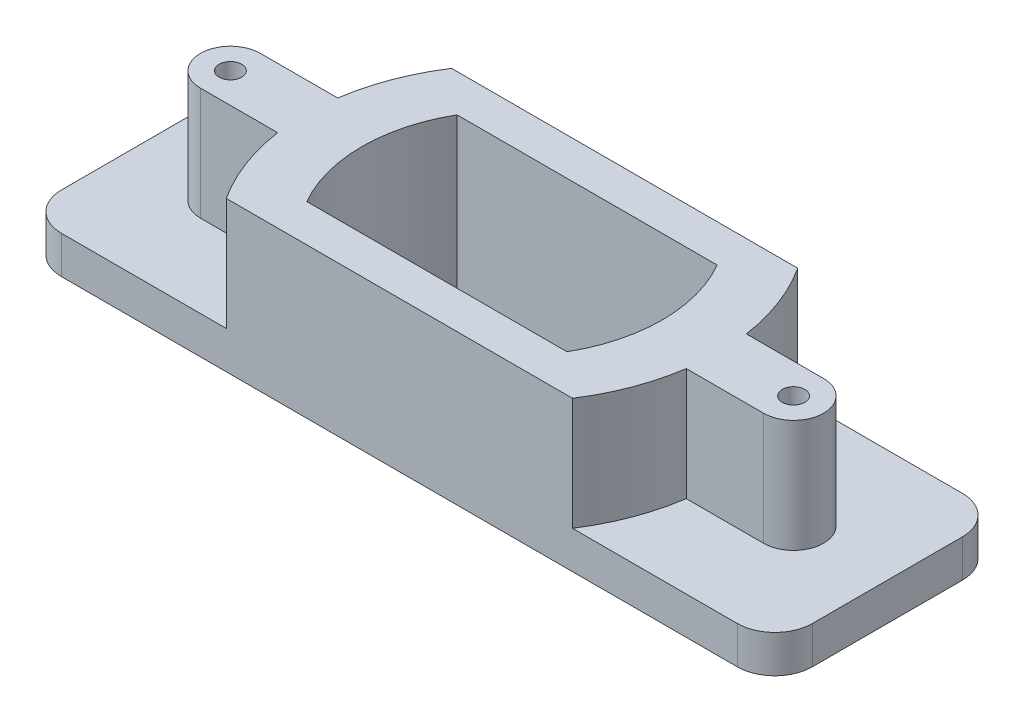
ISO-10303-21;
HEADER;
FILE_DESCRIPTION(('STEP AP214'),'2;1');
FILE_NAME('part.step','',(''),(''),'','','');
FILE_SCHEMA(('AUTOMOTIVE_DESIGN { 1 0 10303 214 1 1 1 1 }'));
ENDSEC;
DATA;
#1=APPLICATION_CONTEXT('core data for automotive mechanical design processes');
#2=APPLICATION_PROTOCOL_DEFINITION('international standard','automotive_design',2000,#1);
#3=PRODUCT_CONTEXT('',#1,'mechanical');
#4=PRODUCT('Part','Part','',(#3));
#5=PRODUCT_RELATED_PRODUCT_CATEGORY('part','',(#4));
#6=PRODUCT_DEFINITION_FORMATION('','',#4);
#7=PRODUCT_DEFINITION_CONTEXT('part definition',#1,'design');
#8=PRODUCT_DEFINITION('design','',#6,#7);
#9=PRODUCT_DEFINITION_SHAPE('','',#8);
#10=(LENGTH_UNIT() NAMED_UNIT(*) SI_UNIT(.MILLI.,.METRE.));
#11=(NAMED_UNIT(*) PLANE_ANGLE_UNIT() SI_UNIT($,.RADIAN.));
#12=(NAMED_UNIT(*) SI_UNIT($,.STERADIAN.) SOLID_ANGLE_UNIT());
#13=UNCERTAINTY_MEASURE_WITH_UNIT(LENGTH_MEASURE(1.E-05),#10,'distance_accuracy_value','');
#14=(GEOMETRIC_REPRESENTATION_CONTEXT(3) GLOBAL_UNCERTAINTY_ASSIGNED_CONTEXT((#13)) GLOBAL_UNIT_ASSIGNED_CONTEXT((#10,
#11,#12)) REPRESENTATION_CONTEXT('',''));
#15=CARTESIAN_POINT('',(0.,0.,0.));
#16=DIRECTION('',(0.,0.,1.));
#17=DIRECTION('',(1.,0.,0.));
#18=AXIS2_PLACEMENT_3D('',#15,#16,#17);
#19=CARTESIAN_POINT('',(-90.,10.,-20.));
#20=DIRECTION('',(0.,1.,0.));
#21=DIRECTION('',(0.,0.,1.));
#22=AXIS2_PLACEMENT_3D('',#19,#20,#21);
#23=PLANE('',#22);
#24=CARTESIAN_POINT('',(0.,10.,0.));
#25=DIRECTION('',(0.,1.,0.));
#26=DIRECTION('',(0.,0.,-1.));
#27=AXIS2_PLACEMENT_3D('',#24,#25,#26);
#28=CIRCLE('',#27,55.);
#29=CARTESIAN_POINT('',(54.4150714416512,10.,-7.99999999999999));
#30=VERTEX_POINT('',#29);
#31=CARTESIAN_POINT('',(46.0977222864645,10.,-30.));
#32=VERTEX_POINT('',#31);
#33=EDGE_CURVE('E241',#30,#32,#28,.T.);
#34=ORIENTED_EDGE('',*,*,#33,.F.);
#35=DIRECTION('',(-1.,0.,0.));
#36=VECTOR('',#35,1.);
#37=CARTESIAN_POINT('',(75.,10.,-7.99999999999999));
#38=LINE('',#37,#36);
#39=CARTESIAN_POINT('',(75.,10.,-7.99999999999999));
#40=VERTEX_POINT('',#39);
#41=EDGE_CURVE('E287',#40,#30,#38,.T.);
#42=ORIENTED_EDGE('',*,*,#41,.F.);
#43=CARTESIAN_POINT('',(75.,10.,0.));
#44=DIRECTION('',(0.,1.,0.));
#45=DIRECTION('',(0.,0.,1.));
#46=AXIS2_PLACEMENT_3D('',#43,#44,#45);
#47=CIRCLE('',#46,7.99999999999999);
#48=CARTESIAN_POINT('',(75.,10.,7.99999999999999));
#49=VERTEX_POINT('',#48);
#50=EDGE_CURVE('E284',#49,#40,#47,.T.);
#51=ORIENTED_EDGE('',*,*,#50,.F.);
#52=DIRECTION('',(1.,0.,0.));
#53=VECTOR('',#52,1.);
#54=CARTESIAN_POINT('',(75.,10.,7.99999999999999));
#55=LINE('',#54,#53);
#56=CARTESIAN_POINT('',(54.4150714416512,10.,7.99999999999999));
#57=VERTEX_POINT('',#56);
#58=EDGE_CURVE('E281',#57,#49,#55,.T.);
#59=ORIENTED_EDGE('',*,*,#58,.F.);
#60=CARTESIAN_POINT('',(0.,10.,0.));
#61=DIRECTION('',(0.,1.,0.));
#62=DIRECTION('',(0.,0.,1.));
#63=AXIS2_PLACEMENT_3D('',#60,#61,#62);
#64=CIRCLE('',#63,55.);
#65=CARTESIAN_POINT('',(46.0977222864644,10.,30.));
#66=VERTEX_POINT('',#65);
#67=EDGE_CURVE('E278',#66,#57,#64,.T.);
#68=ORIENTED_EDGE('',*,*,#67,.F.);
#69=DIRECTION('',(1.,0.,0.));
#70=VECTOR('',#69,1.);
#71=CARTESIAN_POINT('',(-90.,10.,30.));
#72=LINE('',#71,#70);
#73=CARTESIAN_POINT('',(90.,10.,30.));
#74=VERTEX_POINT('',#73);
#75=EDGE_CURVE('E337',#66,#74,#72,.T.);
#76=ORIENTED_EDGE('',*,*,#75,.T.);
#77=CARTESIAN_POINT('',(90.,10.,20.));
#78=DIRECTION('',(0.,1.,0.));
#79=DIRECTION('',(0.,0.,1.));
#80=AXIS2_PLACEMENT_3D('',#77,#78,#79);
#81=CIRCLE('',#80,9.99999999999998);
#82=CARTESIAN_POINT('',(100.,10.,20.));
#83=VERTEX_POINT('',#82);
#84=EDGE_CURVE('E340',#74,#83,#81,.T.);
#85=ORIENTED_EDGE('',*,*,#84,.T.);
#86=DIRECTION('',(0.,0.,-1.));
#87=VECTOR('',#86,1.);
#88=CARTESIAN_POINT('',(100.,10.,20.));
#89=LINE('',#88,#87);
#90=CARTESIAN_POINT('',(100.,10.,-20.));
#91=VERTEX_POINT('',#90);
#92=EDGE_CURVE('E342',#83,#91,#89,.T.);
#93=ORIENTED_EDGE('',*,*,#92,.T.);
#94=CARTESIAN_POINT('',(90.,10.,-20.));
#95=DIRECTION('',(0.,-1.,0.));
#96=DIRECTION('',(0.,0.,-1.));
#97=AXIS2_PLACEMENT_3D('',#94,#95,#96);
#98=CIRCLE('',#97,9.99999999999998);
#99=CARTESIAN_POINT('',(90.,10.,-30.));
#100=VERTEX_POINT('',#99);
#101=EDGE_CURVE('E344',#100,#91,#98,.T.);
#102=ORIENTED_EDGE('',*,*,#101,.F.);
#103=DIRECTION('',(1.,0.,0.));
#104=VECTOR('',#103,1.);
#105=CARTESIAN_POINT('',(-90.,10.,-30.));
#106=LINE('',#105,#104);
#107=EDGE_CURVE('E347',#32,#100,#106,.T.);
#108=ORIENTED_EDGE('',*,*,#107,.F.);
#109=EDGE_LOOP('',(#34,#42,#51,#59,#68,#76,#85,#93,#102,#108));
#110=FACE_BOUND('',#109,.T.);
#111=ADVANCED_FACE('F39',(#110),#23,.T.);
#112=CARTESIAN_POINT('',(-90.,10.,-20.));
#113=DIRECTION('',(0.,-1.,0.));
#114=DIRECTION('',(0.,0.,-1.));
#115=AXIS2_PLACEMENT_3D('',#112,#113,#114);
#116=CYLINDRICAL_SURFACE('',#115,9.99999999999998);
#117=CARTESIAN_POINT('',(-90.,0.,-20.));
#118=DIRECTION('',(0.,1.,0.));
#119=DIRECTION('',(0.,0.,1.));
#120=AXIS2_PLACEMENT_3D('',#117,#118,#119);
#121=CIRCLE('',#120,9.99999999999998);
#122=CARTESIAN_POINT('',(-90.,0.,-30.));
#123=VERTEX_POINT('',#122);
#124=CARTESIAN_POINT('',(-100.,0.,-20.));
#125=VERTEX_POINT('',#124);
#126=EDGE_CURVE('E327',#123,#125,#121,.T.);
#127=ORIENTED_EDGE('',*,*,#126,.T.);
#128=DIRECTION('',(0.,-1.,0.));
#129=VECTOR('',#128,1.);
#130=CARTESIAN_POINT('',(-100.,10.,-20.));
#131=LINE('',#130,#129);
#132=CARTESIAN_POINT('',(-100.,10.,-20.));
#133=VERTEX_POINT('',#132);
#134=EDGE_CURVE('E11',#133,#125,#131,.T.);
#135=ORIENTED_EDGE('',*,*,#134,.F.);
#136=CARTESIAN_POINT('',(-90.,10.,-20.));
#137=DIRECTION('',(0.,1.,0.));
#138=DIRECTION('',(0.,0.,1.));
#139=AXIS2_PLACEMENT_3D('',#136,#137,#138);
#140=CIRCLE('',#139,9.99999999999998);
#141=CARTESIAN_POINT('',(-90.,10.,-30.));
#142=VERTEX_POINT('',#141);
#143=EDGE_CURVE('E328',#142,#133,#140,.T.);
#144=ORIENTED_EDGE('',*,*,#143,.F.);
#145=DIRECTION('',(0.,-1.,0.));
#146=VECTOR('',#145,1.);
#147=CARTESIAN_POINT('',(-90.,10.,-30.));
#148=LINE('',#147,#146);
#149=EDGE_CURVE('E351',#142,#123,#148,.T.);
#150=ORIENTED_EDGE('',*,*,#149,.T.);
#151=EDGE_LOOP('',(#127,#135,#144,#150));
#152=FACE_BOUND('',#151,.T.);
#153=ADVANCED_FACE('F41',(#152),#116,.T.);
#154=CARTESIAN_POINT('',(-100.,10.,20.));
#155=DIRECTION('',(-1.,0.,0.));
#156=DIRECTION('',(0.,0.,1.));
#157=AXIS2_PLACEMENT_3D('',#154,#155,#156);
#158=PLANE('',#157);
#159=DIRECTION('',(0.,0.,-1.));
#160=VECTOR('',#159,1.);
#161=CARTESIAN_POINT('',(-100.,0.,20.));
#162=LINE('',#161,#160);
#163=CARTESIAN_POINT('',(-100.,0.,20.));
#164=VERTEX_POINT('',#163);
#165=EDGE_CURVE('E354',#164,#125,#162,.T.);
#166=ORIENTED_EDGE('',*,*,#165,.F.);
#167=DIRECTION('',(0.,-1.,0.));
#168=VECTOR('',#167,1.);
#169=CARTESIAN_POINT('',(-100.,10.,20.));
#170=LINE('',#169,#168);
#171=CARTESIAN_POINT('',(-100.,10.,20.));
#172=VERTEX_POINT('',#171);
#173=EDGE_CURVE('E47',#172,#164,#170,.T.);
#174=ORIENTED_EDGE('',*,*,#173,.F.);
#175=DIRECTION('',(0.,0.,-1.));
#176=VECTOR('',#175,1.);
#177=CARTESIAN_POINT('',(-100.,10.,20.));
#178=LINE('',#177,#176);
#179=EDGE_CURVE('E330',#172,#133,#178,.T.);
#180=ORIENTED_EDGE('',*,*,#179,.T.);
#181=ORIENTED_EDGE('',*,*,#134,.T.);
#182=EDGE_LOOP('',(#166,#174,#180,#181));
#183=FACE_BOUND('',#182,.T.);
#184=ADVANCED_FACE('F391',(#183),#158,.T.);
#185=CARTESIAN_POINT('',(-90.,10.,20.));
#186=DIRECTION('',(0.,-1.,0.));
#187=DIRECTION('',(0.,0.,-1.));
#188=AXIS2_PLACEMENT_3D('',#185,#186,#187);
#189=CYLINDRICAL_SURFACE('',#188,10.);
#190=CARTESIAN_POINT('',(-90.,0.,20.));
#191=DIRECTION('',(0.,-1.,0.));
#192=DIRECTION('',(0.,0.,-1.));
#193=AXIS2_PLACEMENT_3D('',#190,#191,#192);
#194=CIRCLE('',#193,10.);
#195=CARTESIAN_POINT('',(-90.,0.,30.));
#196=VERTEX_POINT('',#195);
#197=EDGE_CURVE('E357',#196,#164,#194,.T.);
#198=ORIENTED_EDGE('',*,*,#197,.F.);
#199=DIRECTION('',(0.,-1.,0.));
#200=VECTOR('',#199,1.);
#201=CARTESIAN_POINT('',(-90.,10.,30.));
#202=LINE('',#201,#200);
#203=CARTESIAN_POINT('',(-90.,10.,30.));
#204=VERTEX_POINT('',#203);
#205=EDGE_CURVE('E383',#204,#196,#202,.T.);
#206=ORIENTED_EDGE('',*,*,#205,.F.);
#207=CARTESIAN_POINT('',(-90.,10.,20.));
#208=DIRECTION('',(0.,-1.,0.));
#209=DIRECTION('',(0.,0.,-1.));
#210=AXIS2_PLACEMENT_3D('',#207,#208,#209);
#211=CIRCLE('',#210,10.);
#212=EDGE_CURVE('E334',#204,#172,#211,.T.);
#213=ORIENTED_EDGE('',*,*,#212,.T.);
#214=ORIENTED_EDGE('',*,*,#173,.T.);
#215=EDGE_LOOP('',(#198,#206,#213,#214));
#216=FACE_BOUND('',#215,.T.);
#217=ADVANCED_FACE('F387',(#216),#189,.T.);
#218=CARTESIAN_POINT('',(-90.,10.,30.));
#219=DIRECTION('',(0.,0.,-1.));
#220=DIRECTION('',(-1.,0.,0.));
#221=AXIS2_PLACEMENT_3D('',#218,#219,#220);
#222=PLANE('',#221);
#223=DIRECTION('',(1.,0.,0.));
#224=VECTOR('',#223,1.);
#225=CARTESIAN_POINT('',(-90.,0.,30.));
#226=LINE('',#225,#224);
#227=CARTESIAN_POINT('',(90.,0.,30.));
#228=VERTEX_POINT('',#227);
#229=EDGE_CURVE('E360',#196,#228,#226,.T.);
#230=ORIENTED_EDGE('',*,*,#229,.T.);
#231=DIRECTION('',(0.,-1.,0.));
#232=VECTOR('',#231,1.);
#233=CARTESIAN_POINT('',(90.,10.,30.));
#234=LINE('',#233,#232);
#235=EDGE_CURVE('E380',#74,#228,#234,.T.);
#236=ORIENTED_EDGE('',*,*,#235,.F.);
#237=ORIENTED_EDGE('',*,*,#75,.F.);
#238=DIRECTION('',(0.,-1.,0.));
#239=VECTOR('',#238,1.);
#240=CARTESIAN_POINT('',(46.0977222864644,40.,30.));
#241=LINE('',#240,#239);
#242=CARTESIAN_POINT('',(46.0977222864644,40.,30.));
#243=VERTEX_POINT('',#242);
#244=EDGE_CURVE('E309',#243,#66,#241,.T.);
#245=ORIENTED_EDGE('',*,*,#244,.F.);
#246=DIRECTION('',(1.,0.,0.));
#247=VECTOR('',#246,1.);
#248=CARTESIAN_POINT('',(-46.0977222864644,40.,30.));
#249=LINE('',#248,#247);
#250=CARTESIAN_POINT('',(-46.0977222864644,40.,30.));
#251=VERTEX_POINT('',#250);
#252=EDGE_CURVE('E249',#251,#243,#249,.T.);
#253=ORIENTED_EDGE('',*,*,#252,.F.);
#254=DIRECTION('',(0.,-1.,0.));
#255=VECTOR('',#254,1.);
#256=CARTESIAN_POINT('',(-46.0977222864644,40.,30.));
#257=LINE('',#256,#255);
#258=CARTESIAN_POINT('',(-46.0977222864644,10.,30.));
#259=VERTEX_POINT('',#258);
#260=EDGE_CURVE('E312',#251,#259,#257,.T.);
#261=ORIENTED_EDGE('',*,*,#260,.T.);
#262=EDGE_CURVE('E338',#204,#259,#72,.T.);
#263=ORIENTED_EDGE('',*,*,#262,.F.);
#264=ORIENTED_EDGE('',*,*,#205,.T.);
#265=EDGE_LOOP('',(#230,#236,#237,#245,#253,#261,#263,#264));
#266=FACE_BOUND('',#265,.T.);
#267=ADVANCED_FACE('F401',(#266),#222,.F.);
#268=CARTESIAN_POINT('',(90.,10.,20.));
#269=DIRECTION('',(0.,-1.,0.));
#270=DIRECTION('',(0.,0.,-1.));
#271=AXIS2_PLACEMENT_3D('',#268,#269,#270);
#272=CYLINDRICAL_SURFACE('',#271,9.99999999999998);
#273=CARTESIAN_POINT('',(90.,0.,20.));
#274=DIRECTION('',(0.,1.,0.));
#275=DIRECTION('',(0.,0.,1.));
#276=AXIS2_PLACEMENT_3D('',#273,#274,#275);
#277=CIRCLE('',#276,9.99999999999998);
#278=CARTESIAN_POINT('',(100.,0.,20.));
#279=VERTEX_POINT('',#278);
#280=EDGE_CURVE('E362',#228,#279,#277,.T.);
#281=ORIENTED_EDGE('',*,*,#280,.T.);
#282=DIRECTION('',(0.,-1.,0.));
#283=VECTOR('',#282,1.);
#284=CARTESIAN_POINT('',(100.,10.,20.));
#285=LINE('',#284,#283);
#286=EDGE_CURVE('E377',#83,#279,#285,.T.);
#287=ORIENTED_EDGE('',*,*,#286,.F.);
#288=ORIENTED_EDGE('',*,*,#84,.F.);
#289=ORIENTED_EDGE('',*,*,#235,.T.);
#290=EDGE_LOOP('',(#281,#287,#288,#289));
#291=FACE_BOUND('',#290,.T.);
#292=ADVANCED_FACE('F406',(#291),#272,.T.);
#293=CARTESIAN_POINT('',(100.,10.,20.));
#294=DIRECTION('',(-1.,0.,0.));
#295=DIRECTION('',(0.,0.,1.));
#296=AXIS2_PLACEMENT_3D('',#293,#294,#295);
#297=PLANE('',#296);
#298=DIRECTION('',(0.,0.,-1.));
#299=VECTOR('',#298,1.);
#300=CARTESIAN_POINT('',(100.,0.,20.));
#301=LINE('',#300,#299);
#302=CARTESIAN_POINT('',(100.,0.,-20.));
#303=VERTEX_POINT('',#302);
#304=EDGE_CURVE('E364',#279,#303,#301,.T.);
#305=ORIENTED_EDGE('',*,*,#304,.T.);
#306=DIRECTION('',(0.,-1.,0.));
#307=VECTOR('',#306,1.);
#308=CARTESIAN_POINT('',(100.,10.,-20.));
#309=LINE('',#308,#307);
#310=EDGE_CURVE('E375',#91,#303,#309,.T.);
#311=ORIENTED_EDGE('',*,*,#310,.F.);
#312=ORIENTED_EDGE('',*,*,#92,.F.);
#313=ORIENTED_EDGE('',*,*,#286,.T.);
#314=EDGE_LOOP('',(#305,#311,#312,#313));
#315=FACE_BOUND('',#314,.T.);
#316=ADVANCED_FACE('F454',(#315),#297,.F.);
#317=CARTESIAN_POINT('',(90.,10.,-20.));
#318=DIRECTION('',(0.,-1.,0.));
#319=DIRECTION('',(0.,0.,-1.));
#320=AXIS2_PLACEMENT_3D('',#317,#318,#319);
#321=CYLINDRICAL_SURFACE('',#320,9.99999999999998);
#322=CARTESIAN_POINT('',(90.,0.,-20.));
#323=DIRECTION('',(0.,-1.,0.));
#324=DIRECTION('',(0.,0.,-1.));
#325=AXIS2_PLACEMENT_3D('',#322,#323,#324);
#326=CIRCLE('',#325,9.99999999999998);
#327=CARTESIAN_POINT('',(90.,0.,-30.));
#328=VERTEX_POINT('',#327);
#329=EDGE_CURVE('E367',#328,#303,#326,.T.);
#330=ORIENTED_EDGE('',*,*,#329,.F.);
#331=DIRECTION('',(0.,-1.,0.));
#332=VECTOR('',#331,1.);
#333=CARTESIAN_POINT('',(90.,10.,-30.));
#334=LINE('',#333,#332);
#335=EDGE_CURVE('E373',#100,#328,#334,.T.);
#336=ORIENTED_EDGE('',*,*,#335,.F.);
#337=ORIENTED_EDGE('',*,*,#101,.T.);
#338=ORIENTED_EDGE('',*,*,#310,.T.);
#339=EDGE_LOOP('',(#330,#336,#337,#338));
#340=FACE_BOUND('',#339,.T.);
#341=ADVANCED_FACE('F452',(#340),#321,.T.);
#342=CARTESIAN_POINT('',(-90.,10.,-30.));
#343=DIRECTION('',(0.,0.,-1.));
#344=DIRECTION('',(-1.,0.,0.));
#345=AXIS2_PLACEMENT_3D('',#342,#343,#344);
#346=PLANE('',#345);
#347=DIRECTION('',(1.,0.,0.));
#348=VECTOR('',#347,1.);
#349=CARTESIAN_POINT('',(-90.,0.,-30.));
#350=LINE('',#349,#348);
#351=EDGE_CURVE('E331',#123,#328,#350,.T.);
#352=ORIENTED_EDGE('',*,*,#351,.F.);
#353=ORIENTED_EDGE('',*,*,#149,.F.);
#354=CARTESIAN_POINT('',(-46.0977222864645,10.,-30.));
#355=VERTEX_POINT('',#354);
#356=EDGE_CURVE('E348',#142,#355,#106,.T.);
#357=ORIENTED_EDGE('',*,*,#356,.T.);
#358=DIRECTION('',(0.,-1.,0.));
#359=VECTOR('',#358,1.);
#360=CARTESIAN_POINT('',(-46.0977222864644,40.,-30.));
#361=LINE('',#360,#359);
#362=CARTESIAN_POINT('',(-46.0977222864644,40.,-30.));
#363=VERTEX_POINT('',#362);
#364=EDGE_CURVE('E263',#363,#355,#361,.T.);
#365=ORIENTED_EDGE('',*,*,#364,.F.);
#366=DIRECTION('',(-1.,0.,0.));
#367=VECTOR('',#366,1.);
#368=CARTESIAN_POINT('',(-46.0977222864644,40.,-30.));
#369=LINE('',#368,#367);
#370=CARTESIAN_POINT('',(46.0977222864644,40.,-30.));
#371=VERTEX_POINT('',#370);
#372=EDGE_CURVE('E261',#371,#363,#369,.T.);
#373=ORIENTED_EDGE('',*,*,#372,.F.);
#374=DIRECTION('',(0.,-1.,0.));
#375=VECTOR('',#374,1.);
#376=CARTESIAN_POINT('',(46.0977222864644,40.,-30.));
#377=LINE('',#376,#375);
#378=EDGE_CURVE('E294',#371,#32,#377,.T.);
#379=ORIENTED_EDGE('',*,*,#378,.T.);
#380=ORIENTED_EDGE('',*,*,#107,.T.);
#381=ORIENTED_EDGE('',*,*,#335,.T.);
#382=EDGE_LOOP('',(#352,#353,#357,#365,#373,#379,#380,#381));
#383=FACE_BOUND('',#382,.T.);
#384=ADVANCED_FACE('F445',(#383),#346,.T.);
#385=CARTESIAN_POINT('',(0.,10.,0.));
#386=DIRECTION('',(0.,1.,0.));
#387=DIRECTION('',(0.,0.,1.));
#388=AXIS2_PLACEMENT_3D('',#385,#386,#387);
#389=CIRCLE('',#388,55.);
#390=CARTESIAN_POINT('',(-54.4150714416512,10.,-7.99999999999999));
#391=VERTEX_POINT('',#390);
#392=EDGE_CURVE('E236',#355,#391,#389,.T.);
#393=ORIENTED_EDGE('',*,*,#392,.F.);
#394=ORIENTED_EDGE('',*,*,#356,.F.);
#395=ORIENTED_EDGE('',*,*,#143,.T.);
#396=ORIENTED_EDGE('',*,*,#179,.F.);
#397=ORIENTED_EDGE('',*,*,#212,.F.);
#398=ORIENTED_EDGE('',*,*,#262,.T.);
#399=CARTESIAN_POINT('',(0.,10.,0.));
#400=DIRECTION('',(0.,1.,0.));
#401=DIRECTION('',(0.,0.,-1.));
#402=AXIS2_PLACEMENT_3D('',#399,#400,#401);
#403=CIRCLE('',#402,55.);
#404=CARTESIAN_POINT('',(-54.4150714416512,10.,8.00000000000002));
#405=VERTEX_POINT('',#404);
#406=EDGE_CURVE('E275',#405,#259,#403,.T.);
#407=ORIENTED_EDGE('',*,*,#406,.F.);
#408=DIRECTION('',(1.,0.,0.));
#409=VECTOR('',#408,1.);
#410=CARTESIAN_POINT('',(-75.,10.,7.99999999999999));
#411=LINE('',#410,#409);
#412=CARTESIAN_POINT('',(-75.,10.,7.99999999999999));
#413=VERTEX_POINT('',#412);
#414=EDGE_CURVE('E272',#413,#405,#411,.T.);
#415=ORIENTED_EDGE('',*,*,#414,.F.);
#416=CARTESIAN_POINT('',(-75.,10.,0.));
#417=DIRECTION('',(0.,1.,0.));
#418=DIRECTION('',(0.,0.,-1.));
#419=AXIS2_PLACEMENT_3D('',#416,#417,#418);
#420=CIRCLE('',#419,7.99999999999999);
#421=CARTESIAN_POINT('',(-75.,10.,-7.99999999999999));
#422=VERTEX_POINT('',#421);
#423=EDGE_CURVE('E269',#422,#413,#420,.T.);
#424=ORIENTED_EDGE('',*,*,#423,.F.);
#425=DIRECTION('',(-1.,0.,0.));
#426=VECTOR('',#425,1.);
#427=CARTESIAN_POINT('',(-75.,10.,-7.99999999999999));
#428=LINE('',#427,#426);
#429=EDGE_CURVE('E266',#391,#422,#428,.T.);
#430=ORIENTED_EDGE('',*,*,#429,.F.);
#431=EDGE_LOOP('',(#393,#394,#395,#396,#397,#398,#407,#415,#424,#430));
#432=FACE_BOUND('',#431,.T.);
#433=ADVANCED_FACE('F426',(#432),#23,.T.);
#434=CARTESIAN_POINT('',(-90.,0.,-20.));
#435=DIRECTION('',(0.,1.,0.));
#436=DIRECTION('',(0.,0.,1.));
#437=AXIS2_PLACEMENT_3D('',#434,#435,#436);
#438=PLANE('',#437);
#439=CARTESIAN_POINT('',(75.,0.,0.));
#440=DIRECTION('',(0.,-1.,0.));
#441=DIRECTION('',(0.,0.,1.));
#442=AXIS2_PLACEMENT_3D('',#439,#440,#441);
#443=CIRCLE('',#442,3.00000000000001);
#444=CARTESIAN_POINT('',(75.,0.,3.));
#445=VERTEX_POINT('',#444);
#446=EDGE_CURVE('E763',#445,#445,#443,.T.);
#447=ORIENTED_EDGE('',*,*,#446,.F.);
#448=EDGE_LOOP('',(#447));
#449=FACE_BOUND('',#448,.T.);
#450=CARTESIAN_POINT('',(-75.,0.,0.));
#451=DIRECTION('',(0.,-1.,0.));
#452=DIRECTION('',(0.,0.,-1.));
#453=AXIS2_PLACEMENT_3D('',#450,#451,#452);
#454=CIRCLE('',#453,3.00000000000001);
#455=CARTESIAN_POINT('',(-75.,0.,-3.00000000000002));
#456=VERTEX_POINT('',#455);
#457=EDGE_CURVE('E771',#456,#456,#454,.T.);
#458=ORIENTED_EDGE('',*,*,#457,.F.);
#459=EDGE_LOOP('',(#458));
#460=FACE_BOUND('',#459,.T.);
#461=CARTESIAN_POINT('',(0.,0.,0.));
#462=DIRECTION('',(0.,-1.,0.));
#463=DIRECTION('',(0.,0.,-1.));
#464=AXIS2_PLACEMENT_3D('',#461,#462,#463);
#465=CIRCLE('',#464,40.);
#466=CARTESIAN_POINT('',(-34.6410161513775,0.,20.));
#467=VERTEX_POINT('',#466);
#468=CARTESIAN_POINT('',(-34.6410161513775,0.,-20.));
#469=VERTEX_POINT('',#468);
#470=EDGE_CURVE('E223',#467,#469,#465,.T.);
#471=ORIENTED_EDGE('',*,*,#470,.F.);
#472=DIRECTION('',(-1.,0.,0.));
#473=VECTOR('',#472,1.);
#474=CARTESIAN_POINT('',(34.6410161513775,0.,20.));
#475=LINE('',#474,#473);
#476=CARTESIAN_POINT('',(34.6410161513775,0.,20.));
#477=VERTEX_POINT('',#476);
#478=EDGE_CURVE('E216',#477,#467,#475,.T.);
#479=ORIENTED_EDGE('',*,*,#478,.F.);
#480=CARTESIAN_POINT('',(0.,0.,0.));
#481=DIRECTION('',(0.,-1.,0.));
#482=DIRECTION('',(0.,0.,1.));
#483=AXIS2_PLACEMENT_3D('',#480,#481,#482);
#484=CIRCLE('',#483,40.);
#485=CARTESIAN_POINT('',(34.6410161513775,0.,-20.));
#486=VERTEX_POINT('',#485);
#487=EDGE_CURVE('E227',#486,#477,#484,.T.);
#488=ORIENTED_EDGE('',*,*,#487,.F.);
#489=DIRECTION('',(1.,0.,0.));
#490=VECTOR('',#489,1.);
#491=CARTESIAN_POINT('',(34.6410161513775,0.,-20.));
#492=LINE('',#491,#490);
#493=EDGE_CURVE('E54',#469,#486,#492,.T.);
#494=ORIENTED_EDGE('',*,*,#493,.F.);
#495=EDGE_LOOP('',(#471,#479,#488,#494));
#496=FACE_BOUND('',#495,.T.);
#497=ORIENTED_EDGE('',*,*,#126,.F.);
#498=ORIENTED_EDGE('',*,*,#351,.T.);
#499=ORIENTED_EDGE('',*,*,#329,.T.);
#500=ORIENTED_EDGE('',*,*,#304,.F.);
#501=ORIENTED_EDGE('',*,*,#280,.F.);
#502=ORIENTED_EDGE('',*,*,#229,.F.);
#503=ORIENTED_EDGE('',*,*,#197,.T.);
#504=ORIENTED_EDGE('',*,*,#165,.T.);
#505=EDGE_LOOP('',(#497,#498,#499,#500,#501,#502,#503,#504));
#506=FACE_BOUND('',#505,.T.);
#507=ADVANCED_FACE('F396',(#449,#460,#496,#506),#438,.F.);
#508=CARTESIAN_POINT('',(0.,40.,0.));
#509=DIRECTION('',(0.,-1.,0.));
#510=DIRECTION('',(0.,0.,-1.));
#511=AXIS2_PLACEMENT_3D('',#508,#509,#510);
#512=CYLINDRICAL_SURFACE('',#511,55.);
#513=ORIENTED_EDGE('',*,*,#392,.T.);
#514=DIRECTION('',(0.,-1.,0.));
#515=VECTOR('',#514,1.);
#516=CARTESIAN_POINT('',(-54.4150714416512,40.,-7.99999999999999));
#517=LINE('',#516,#515);
#518=CARTESIAN_POINT('',(-54.4150714416512,40.,-7.99999999999999));
#519=VERTEX_POINT('',#518);
#520=EDGE_CURVE('E324',#519,#391,#517,.T.);
#521=ORIENTED_EDGE('',*,*,#520,.F.);
#522=CARTESIAN_POINT('',(0.,40.,0.));
#523=DIRECTION('',(0.,1.,0.));
#524=DIRECTION('',(0.,0.,1.));
#525=AXIS2_PLACEMENT_3D('',#522,#523,#524);
#526=CIRCLE('',#525,55.);
#527=EDGE_CURVE('E237',#363,#519,#526,.T.);
#528=ORIENTED_EDGE('',*,*,#527,.F.);
#529=ORIENTED_EDGE('',*,*,#364,.T.);
#530=EDGE_LOOP('',(#513,#521,#528,#529));
#531=FACE_BOUND('',#530,.T.);
#532=ADVANCED_FACE('F440',(#531),#512,.T.);
#533=CARTESIAN_POINT('',(-75.,40.,-7.99999999999999));
#534=DIRECTION('',(0.,0.,1.));
#535=DIRECTION('',(1.,0.,0.));
#536=AXIS2_PLACEMENT_3D('',#533,#534,#535);
#537=PLANE('',#536);
#538=ORIENTED_EDGE('',*,*,#429,.T.);
#539=DIRECTION('',(0.,-1.,0.));
#540=VECTOR('',#539,1.);
#541=CARTESIAN_POINT('',(-75.,40.,-7.99999999999999));
#542=LINE('',#541,#540);
#543=CARTESIAN_POINT('',(-75.,40.,-7.99999999999999));
#544=VERTEX_POINT('',#543);
#545=EDGE_CURVE('E321',#544,#422,#542,.T.);
#546=ORIENTED_EDGE('',*,*,#545,.F.);
#547=DIRECTION('',(-1.,0.,0.));
#548=VECTOR('',#547,1.);
#549=CARTESIAN_POINT('',(-75.,40.,-7.99999999999999));
#550=LINE('',#549,#548);
#551=EDGE_CURVE('E240',#519,#544,#550,.T.);
#552=ORIENTED_EDGE('',*,*,#551,.F.);
#553=ORIENTED_EDGE('',*,*,#520,.T.);
#554=EDGE_LOOP('',(#538,#546,#552,#553));
#555=FACE_BOUND('',#554,.T.);
#556=ADVANCED_FACE('F436',(#555),#537,.F.);
#557=CARTESIAN_POINT('',(-75.,40.,0.));
#558=DIRECTION('',(0.,-1.,0.));
#559=DIRECTION('',(0.,0.,-1.));
#560=AXIS2_PLACEMENT_3D('',#557,#558,#559);
#561=CYLINDRICAL_SURFACE('',#560,7.99999999999999);
#562=ORIENTED_EDGE('',*,*,#423,.T.);
#563=DIRECTION('',(0.,-1.,0.));
#564=VECTOR('',#563,1.);
#565=CARTESIAN_POINT('',(-75.,40.,7.99999999999999));
#566=LINE('',#565,#564);
#567=CARTESIAN_POINT('',(-75.,40.,7.99999999999999));
#568=VERTEX_POINT('',#567);
#569=EDGE_CURVE('E318',#568,#413,#566,.T.);
#570=ORIENTED_EDGE('',*,*,#569,.F.);
#571=CARTESIAN_POINT('',(-75.,40.,0.));
#572=DIRECTION('',(0.,1.,0.));
#573=DIRECTION('',(0.,0.,-1.));
#574=AXIS2_PLACEMENT_3D('',#571,#572,#573);
#575=CIRCLE('',#574,7.99999999999999);
#576=EDGE_CURVE('E243',#544,#568,#575,.T.);
#577=ORIENTED_EDGE('',*,*,#576,.F.);
#578=ORIENTED_EDGE('',*,*,#545,.T.);
#579=EDGE_LOOP('',(#562,#570,#577,#578));
#580=FACE_BOUND('',#579,.T.);
#581=ADVANCED_FACE('F433',(#580),#561,.T.);
#582=CARTESIAN_POINT('',(-75.,40.,7.99999999999999));
#583=DIRECTION('',(0.,0.,-1.));
#584=DIRECTION('',(-1.,0.,0.));
#585=AXIS2_PLACEMENT_3D('',#582,#583,#584);
#586=PLANE('',#585);
#587=ORIENTED_EDGE('',*,*,#414,.T.);
#588=DIRECTION('',(0.,-1.,0.));
#589=VECTOR('',#588,1.);
#590=CARTESIAN_POINT('',(-54.4150714416512,40.,8.00000000000002));
#591=LINE('',#590,#589);
#592=CARTESIAN_POINT('',(-54.4150714416512,40.,8.00000000000002));
#593=VERTEX_POINT('',#592);
#594=EDGE_CURVE('E315',#593,#405,#591,.T.);
#595=ORIENTED_EDGE('',*,*,#594,.F.);
#596=DIRECTION('',(1.,0.,0.));
#597=VECTOR('',#596,1.);
#598=CARTESIAN_POINT('',(-75.,40.,7.99999999999999));
#599=LINE('',#598,#597);
#600=EDGE_CURVE('E245',#568,#593,#599,.T.);
#601=ORIENTED_EDGE('',*,*,#600,.F.);
#602=ORIENTED_EDGE('',*,*,#569,.T.);
#603=EDGE_LOOP('',(#587,#595,#601,#602));
#604=FACE_BOUND('',#603,.T.);
#605=ADVANCED_FACE('F428',(#604),#586,.F.);
#606=CARTESIAN_POINT('',(0.,40.,0.));
#607=DIRECTION('',(0.,-1.,0.));
#608=DIRECTION('',(0.,0.,-1.));
#609=AXIS2_PLACEMENT_3D('',#606,#607,#608);
#610=CYLINDRICAL_SURFACE('',#609,55.);
#611=ORIENTED_EDGE('',*,*,#406,.T.);
#612=ORIENTED_EDGE('',*,*,#260,.F.);
#613=CARTESIAN_POINT('',(0.,40.,0.));
#614=DIRECTION('',(0.,1.,0.));
#615=DIRECTION('',(0.,0.,-1.));
#616=AXIS2_PLACEMENT_3D('',#613,#614,#615);
#617=CIRCLE('',#616,55.);
#618=EDGE_CURVE('E247',#593,#251,#617,.T.);
#619=ORIENTED_EDGE('',*,*,#618,.F.);
#620=ORIENTED_EDGE('',*,*,#594,.T.);
#621=EDGE_LOOP('',(#611,#612,#619,#620));
#622=FACE_BOUND('',#621,.T.);
#623=ADVANCED_FACE('F423',(#622),#610,.T.);
#624=CARTESIAN_POINT('',(0.,40.,0.));
#625=DIRECTION('',(0.,-1.,0.));
#626=DIRECTION('',(0.,0.,-1.));
#627=AXIS2_PLACEMENT_3D('',#624,#625,#626);
#628=CYLINDRICAL_SURFACE('',#627,55.);
#629=ORIENTED_EDGE('',*,*,#67,.T.);
#630=DIRECTION('',(0.,-1.,0.));
#631=VECTOR('',#630,1.);
#632=CARTESIAN_POINT('',(54.4150714416512,40.,7.99999999999999));
#633=LINE('',#632,#631);
#634=CARTESIAN_POINT('',(54.4150714416512,40.,7.99999999999999));
#635=VERTEX_POINT('',#634);
#636=EDGE_CURVE('E306',#635,#57,#633,.T.);
#637=ORIENTED_EDGE('',*,*,#636,.F.);
#638=CARTESIAN_POINT('',(0.,40.,0.));
#639=DIRECTION('',(0.,1.,0.));
#640=DIRECTION('',(0.,0.,1.));
#641=AXIS2_PLACEMENT_3D('',#638,#639,#640);
#642=CIRCLE('',#641,55.);
#643=EDGE_CURVE('E251',#243,#635,#642,.T.);
#644=ORIENTED_EDGE('',*,*,#643,.F.);
#645=ORIENTED_EDGE('',*,*,#244,.T.);
#646=EDGE_LOOP('',(#629,#637,#644,#645));
#647=FACE_BOUND('',#646,.T.);
#648=ADVANCED_FACE('F416',(#647),#628,.T.);
#649=CARTESIAN_POINT('',(75.,40.,7.99999999999999));
#650=DIRECTION('',(0.,0.,-1.));
#651=DIRECTION('',(-1.,0.,0.));
#652=AXIS2_PLACEMENT_3D('',#649,#650,#651);
#653=PLANE('',#652);
#654=ORIENTED_EDGE('',*,*,#58,.T.);
#655=DIRECTION('',(0.,-1.,0.));
#656=VECTOR('',#655,1.);
#657=CARTESIAN_POINT('',(75.,40.,7.99999999999999));
#658=LINE('',#657,#656);
#659=CARTESIAN_POINT('',(75.,40.,7.99999999999999));
#660=VERTEX_POINT('',#659);
#661=EDGE_CURVE('E303',#660,#49,#658,.T.);
#662=ORIENTED_EDGE('',*,*,#661,.F.);
#663=DIRECTION('',(1.,0.,0.));
#664=VECTOR('',#663,1.);
#665=CARTESIAN_POINT('',(75.,40.,7.99999999999999));
#666=LINE('',#665,#664);
#667=EDGE_CURVE('E253',#635,#660,#666,.T.);
#668=ORIENTED_EDGE('',*,*,#667,.F.);
#669=ORIENTED_EDGE('',*,*,#636,.T.);
#670=EDGE_LOOP('',(#654,#662,#668,#669));
#671=FACE_BOUND('',#670,.T.);
#672=ADVANCED_FACE('F673',(#671),#653,.F.);
#673=CARTESIAN_POINT('',(75.,40.,0.));
#674=DIRECTION('',(0.,-1.,0.));
#675=DIRECTION('',(0.,0.,-1.));
#676=AXIS2_PLACEMENT_3D('',#673,#674,#675);
#677=CYLINDRICAL_SURFACE('',#676,7.99999999999999);
#678=ORIENTED_EDGE('',*,*,#50,.T.);
#679=DIRECTION('',(0.,-1.,0.));
#680=VECTOR('',#679,1.);
#681=CARTESIAN_POINT('',(75.,40.,-7.99999999999999));
#682=LINE('',#681,#680);
#683=CARTESIAN_POINT('',(75.,40.,-7.99999999999999));
#684=VERTEX_POINT('',#683);
#685=EDGE_CURVE('E300',#684,#40,#682,.T.);
#686=ORIENTED_EDGE('',*,*,#685,.F.);
#687=CARTESIAN_POINT('',(75.,40.,0.));
#688=DIRECTION('',(0.,1.,0.));
#689=DIRECTION('',(0.,0.,1.));
#690=AXIS2_PLACEMENT_3D('',#687,#688,#689);
#691=CIRCLE('',#690,7.99999999999999);
#692=EDGE_CURVE('E255',#660,#684,#691,.T.);
#693=ORIENTED_EDGE('',*,*,#692,.F.);
#694=ORIENTED_EDGE('',*,*,#661,.T.);
#695=EDGE_LOOP('',(#678,#686,#693,#694));
#696=FACE_BOUND('',#695,.T.);
#697=ADVANCED_FACE('F664',(#696),#677,.T.);
#698=CARTESIAN_POINT('',(75.,40.,-7.99999999999999));
#699=DIRECTION('',(0.,0.,1.));
#700=DIRECTION('',(1.,0.,0.));
#701=AXIS2_PLACEMENT_3D('',#698,#699,#700);
#702=PLANE('',#701);
#703=ORIENTED_EDGE('',*,*,#41,.T.);
#704=DIRECTION('',(0.,-1.,0.));
#705=VECTOR('',#704,1.);
#706=CARTESIAN_POINT('',(54.4150714416512,40.,-7.99999999999999));
#707=LINE('',#706,#705);
#708=CARTESIAN_POINT('',(54.4150714416512,40.,-7.99999999999999));
#709=VERTEX_POINT('',#708);
#710=EDGE_CURVE('E297',#709,#30,#707,.T.);
#711=ORIENTED_EDGE('',*,*,#710,.F.);
#712=DIRECTION('',(-1.,0.,0.));
#713=VECTOR('',#712,1.);
#714=CARTESIAN_POINT('',(75.,40.,-7.99999999999999));
#715=LINE('',#714,#713);
#716=EDGE_CURVE('E257',#684,#709,#715,.T.);
#717=ORIENTED_EDGE('',*,*,#716,.F.);
#718=ORIENTED_EDGE('',*,*,#685,.T.);
#719=EDGE_LOOP('',(#703,#711,#717,#718));
#720=FACE_BOUND('',#719,.T.);
#721=ADVANCED_FACE('F655',(#720),#702,.F.);
#722=CARTESIAN_POINT('',(0.,40.,0.));
#723=DIRECTION('',(0.,-1.,0.));
#724=DIRECTION('',(0.,0.,-1.));
#725=AXIS2_PLACEMENT_3D('',#722,#723,#724);
#726=CYLINDRICAL_SURFACE('',#725,55.);
#727=ORIENTED_EDGE('',*,*,#33,.T.);
#728=ORIENTED_EDGE('',*,*,#378,.F.);
#729=CARTESIAN_POINT('',(0.,40.,0.));
#730=DIRECTION('',(0.,1.,0.));
#731=DIRECTION('',(0.,0.,-1.));
#732=AXIS2_PLACEMENT_3D('',#729,#730,#731);
#733=CIRCLE('',#732,55.);
#734=EDGE_CURVE('E259',#709,#371,#733,.T.);
#735=ORIENTED_EDGE('',*,*,#734,.F.);
#736=ORIENTED_EDGE('',*,*,#710,.T.);
#737=EDGE_LOOP('',(#727,#728,#735,#736));
#738=FACE_BOUND('',#737,.T.);
#739=ADVANCED_FACE('F571',(#738),#726,.T.);
#740=CARTESIAN_POINT('',(0.,40.,0.));
#741=DIRECTION('',(0.,1.,0.));
#742=DIRECTION('',(0.,0.,1.));
#743=AXIS2_PLACEMENT_3D('',#740,#741,#742);
#744=PLANE('',#743);
#745=CARTESIAN_POINT('',(75.,40.,0.));
#746=DIRECTION('',(0.,1.,0.));
#747=DIRECTION('',(0.,0.,1.));
#748=AXIS2_PLACEMENT_3D('',#745,#746,#747);
#749=CIRCLE('',#748,3.00000000000001);
#750=CARTESIAN_POINT('',(75.,40.,3.));
#751=VERTEX_POINT('',#750);
#752=EDGE_CURVE('E766',#751,#751,#749,.F.);
#753=ORIENTED_EDGE('',*,*,#752,.T.);
#754=EDGE_LOOP('',(#753));
#755=FACE_BOUND('',#754,.T.);
#756=CARTESIAN_POINT('',(-75.,40.,0.));
#757=DIRECTION('',(0.,1.,0.));
#758=DIRECTION('',(0.,0.,1.));
#759=AXIS2_PLACEMENT_3D('',#756,#757,#758);
#760=CIRCLE('',#759,3.00000000000001);
#761=CARTESIAN_POINT('',(-75.,40.,3.));
#762=VERTEX_POINT('',#761);
#763=EDGE_CURVE('E768',#762,#762,#760,.F.);
#764=ORIENTED_EDGE('',*,*,#763,.T.);
#765=EDGE_LOOP('',(#764));
#766=FACE_BOUND('',#765,.T.);
#767=DIRECTION('',(-1.,0.,0.));
#768=VECTOR('',#767,1.);
#769=CARTESIAN_POINT('',(34.6410161513775,40.,20.));
#770=LINE('',#769,#768);
#771=CARTESIAN_POINT('',(34.6410161513775,40.,20.));
#772=VERTEX_POINT('',#771);
#773=CARTESIAN_POINT('',(-34.6410161513775,40.,20.));
#774=VERTEX_POINT('',#773);
#775=EDGE_CURVE('E213',#772,#774,#770,.T.);
#776=ORIENTED_EDGE('',*,*,#775,.T.);
#777=CARTESIAN_POINT('',(0.,40.,0.));
#778=DIRECTION('',(0.,1.,0.));
#779=DIRECTION('',(0.,0.,1.));
#780=AXIS2_PLACEMENT_3D('',#777,#778,#779);
#781=CIRCLE('',#780,40.);
#782=CARTESIAN_POINT('',(-34.6410161513775,40.,-20.));
#783=VERTEX_POINT('',#782);
#784=EDGE_CURVE('E200',#774,#783,#781,.F.);
#785=ORIENTED_EDGE('',*,*,#784,.T.);
#786=DIRECTION('',(1.,0.,0.));
#787=VECTOR('',#786,1.);
#788=CARTESIAN_POINT('',(34.6410161513775,40.,-20.));
#789=LINE('',#788,#787);
#790=CARTESIAN_POINT('',(34.6410161513775,40.,-20.));
#791=VERTEX_POINT('',#790);
#792=EDGE_CURVE('E231',#783,#791,#789,.T.);
#793=ORIENTED_EDGE('',*,*,#792,.T.);
#794=CARTESIAN_POINT('',(0.,40.,0.));
#795=DIRECTION('',(0.,1.,0.));
#796=DIRECTION('',(0.,0.,1.));
#797=AXIS2_PLACEMENT_3D('',#794,#795,#796);
#798=CIRCLE('',#797,40.);
#799=EDGE_CURVE('E221',#791,#772,#798,.F.);
#800=ORIENTED_EDGE('',*,*,#799,.T.);
#801=EDGE_LOOP('',(#776,#785,#793,#800));
#802=FACE_BOUND('',#801,.T.);
#803=ORIENTED_EDGE('',*,*,#527,.T.);
#804=ORIENTED_EDGE('',*,*,#551,.T.);
#805=ORIENTED_EDGE('',*,*,#576,.T.);
#806=ORIENTED_EDGE('',*,*,#600,.T.);
#807=ORIENTED_EDGE('',*,*,#618,.T.);
#808=ORIENTED_EDGE('',*,*,#252,.T.);
#809=ORIENTED_EDGE('',*,*,#643,.T.);
#810=ORIENTED_EDGE('',*,*,#667,.T.);
#811=ORIENTED_EDGE('',*,*,#692,.T.);
#812=ORIENTED_EDGE('',*,*,#716,.T.);
#813=ORIENTED_EDGE('',*,*,#734,.T.);
#814=ORIENTED_EDGE('',*,*,#372,.T.);
#815=EDGE_LOOP('',(#803,#804,#805,#806,#807,#808,#809,#810,#811,#812,#813,#814));
#816=FACE_BOUND('',#815,.T.);
#817=ADVANCED_FACE('F219',(#755,#766,#802,#816),#744,.T.);
#818=CARTESIAN_POINT('',(34.6410161513775,129.442719099992,20.));
#819=DIRECTION('',(0.,0.,1.));
#820=DIRECTION('',(1.,0.,0.));
#821=AXIS2_PLACEMENT_3D('',#818,#819,#820);
#822=PLANE('',#821);
#823=DIRECTION('',(0.,-1.,0.));
#824=VECTOR('',#823,1.);
#825=CARTESIAN_POINT('',(34.6410161513775,129.442719099992,20.));
#826=LINE('',#825,#824);
#827=EDGE_CURVE('E62',#772,#477,#826,.T.);
#828=ORIENTED_EDGE('',*,*,#827,.T.);
#829=ORIENTED_EDGE('',*,*,#478,.T.);
#830=DIRECTION('',(0.,-1.,0.));
#831=VECTOR('',#830,1.);
#832=CARTESIAN_POINT('',(-34.6410161513775,129.442719099992,20.));
#833=LINE('',#832,#831);
#834=EDGE_CURVE('E204',#774,#467,#833,.T.);
#835=ORIENTED_EDGE('',*,*,#834,.F.);
#836=ORIENTED_EDGE('',*,*,#775,.F.);
#837=EDGE_LOOP('',(#828,#829,#835,#836));
#838=FACE_BOUND('',#837,.T.);
#839=ADVANCED_FACE('F212',(#838),#822,.F.);
#840=CARTESIAN_POINT('',(0.,129.442719099992,0.));
#841=DIRECTION('',(0.,-1.,0.));
#842=DIRECTION('',(0.,0.,-1.));
#843=AXIS2_PLACEMENT_3D('',#840,#841,#842);
#844=CYLINDRICAL_SURFACE('',#843,40.);
#845=ORIENTED_EDGE('',*,*,#834,.T.);
#846=ORIENTED_EDGE('',*,*,#470,.T.);
#847=DIRECTION('',(0.,-1.,0.));
#848=VECTOR('',#847,1.);
#849=CARTESIAN_POINT('',(-34.6410161513775,129.442719099992,-20.));
#850=LINE('',#849,#848);
#851=EDGE_CURVE('E206',#783,#469,#850,.T.);
#852=ORIENTED_EDGE('',*,*,#851,.F.);
#853=ORIENTED_EDGE('',*,*,#784,.F.);
#854=EDGE_LOOP('',(#845,#846,#852,#853));
#855=FACE_BOUND('',#854,.T.);
#856=ADVANCED_FACE('F202',(#855),#844,.F.);
#857=CARTESIAN_POINT('',(34.6410161513775,129.442719099992,-20.));
#858=DIRECTION('',(0.,0.,-1.));
#859=DIRECTION('',(-1.,0.,0.));
#860=AXIS2_PLACEMENT_3D('',#857,#858,#859);
#861=PLANE('',#860);
#862=ORIENTED_EDGE('',*,*,#851,.T.);
#863=ORIENTED_EDGE('',*,*,#493,.T.);
#864=DIRECTION('',(0.,-1.,0.));
#865=VECTOR('',#864,1.);
#866=CARTESIAN_POINT('',(34.6410161513775,129.442719099992,-20.));
#867=LINE('',#866,#865);
#868=EDGE_CURVE('E230',#791,#486,#867,.T.);
#869=ORIENTED_EDGE('',*,*,#868,.F.);
#870=ORIENTED_EDGE('',*,*,#792,.F.);
#871=EDGE_LOOP('',(#862,#863,#869,#870));
#872=FACE_BOUND('',#871,.T.);
#873=ADVANCED_FACE('F599',(#872),#861,.F.);
#874=CARTESIAN_POINT('',(0.,129.442719099992,0.));
#875=DIRECTION('',(0.,-1.,0.));
#876=DIRECTION('',(0.,0.,-1.));
#877=AXIS2_PLACEMENT_3D('',#874,#875,#876);
#878=CYLINDRICAL_SURFACE('',#877,40.);
#879=ORIENTED_EDGE('',*,*,#868,.T.);
#880=ORIENTED_EDGE('',*,*,#487,.T.);
#881=ORIENTED_EDGE('',*,*,#827,.F.);
#882=ORIENTED_EDGE('',*,*,#799,.F.);
#883=EDGE_LOOP('',(#879,#880,#881,#882));
#884=FACE_BOUND('',#883,.T.);
#885=ADVANCED_FACE('F609',(#884),#878,.F.);
#886=CARTESIAN_POINT('',(-75.,129.442719099992,0.));
#887=DIRECTION('',(0.,-1.,0.));
#888=DIRECTION('',(0.,0.,-1.));
#889=AXIS2_PLACEMENT_3D('',#886,#887,#888);
#890=CYLINDRICAL_SURFACE('',#889,3.00000000000001);
#891=ORIENTED_EDGE('',*,*,#457,.T.);
#892=EDGE_LOOP('',(#891));
#893=FACE_BOUND('',#892,.T.);
#894=ORIENTED_EDGE('',*,*,#763,.F.);
#895=EDGE_LOOP('',(#894));
#896=FACE_BOUND('',#895,.T.);
#897=ADVANCED_FACE('F619',(#893,#896),#890,.F.);
#898=CARTESIAN_POINT('',(75.,129.442719099992,0.));
#899=DIRECTION('',(0.,-1.,0.));
#900=DIRECTION('',(0.,0.,-1.));
#901=AXIS2_PLACEMENT_3D('',#898,#899,#900);
#902=CYLINDRICAL_SURFACE('',#901,3.00000000000001);
#903=ORIENTED_EDGE('',*,*,#446,.T.);
#904=EDGE_LOOP('',(#903));
#905=FACE_BOUND('',#904,.T.);
#906=ORIENTED_EDGE('',*,*,#752,.F.);
#907=EDGE_LOOP('',(#906));
#908=FACE_BOUND('',#907,.T.);
#909=ADVANCED_FACE('F629',(#905,#908),#902,.F.);
#910=CLOSED_SHELL('',(#111,#153,#184,#217,#267,#292,#316,#341,#384,#433,#507,#532,#556,#581,
#605,#623,#648,#672,#697,#721,#739,#817,#839,#856,#873,#885,#897,#909));
#911=MANIFOLD_SOLID_BREP('B2',#910);
#912=ADVANCED_BREP_SHAPE_REPRESENTATION('',(#18,#911),#14);
#913=SHAPE_DEFINITION_REPRESENTATION(#9,#912);
ENDSEC;
END-ISO-10303-21;
